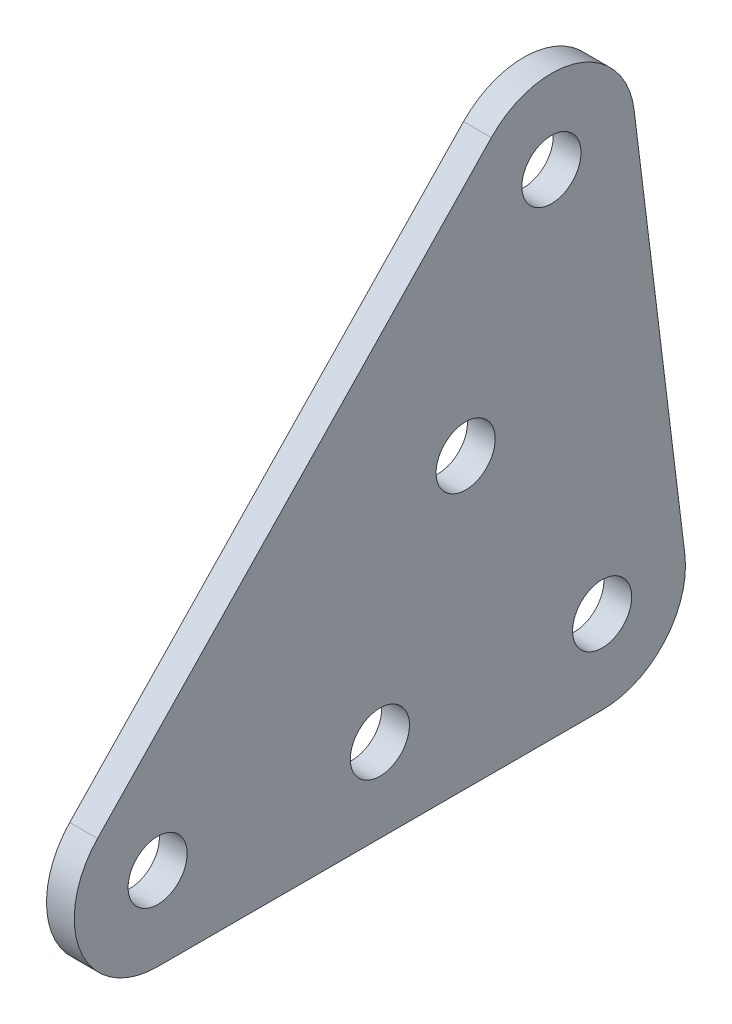
ISO-10303-21;
HEADER;
FILE_DESCRIPTION(('STEP AP214'),'2;1');
FILE_NAME('part.step','',(''),(''),'','','');
FILE_SCHEMA(('AUTOMOTIVE_DESIGN { 1 0 10303 214 1 1 1 1 }'));
ENDSEC;
DATA;
#1=APPLICATION_CONTEXT('core data for automotive mechanical design processes');
#2=APPLICATION_PROTOCOL_DEFINITION('international standard','automotive_design',2000,#1);
#3=PRODUCT_CONTEXT('',#1,'mechanical');
#4=PRODUCT('Part','Part','',(#3));
#5=PRODUCT_RELATED_PRODUCT_CATEGORY('part','',(#4));
#6=PRODUCT_DEFINITION_FORMATION('','',#4);
#7=PRODUCT_DEFINITION_CONTEXT('part definition',#1,'design');
#8=PRODUCT_DEFINITION('design','',#6,#7);
#9=PRODUCT_DEFINITION_SHAPE('','',#8);
#10=(LENGTH_UNIT() NAMED_UNIT(*) SI_UNIT(.MILLI.,.METRE.));
#11=(NAMED_UNIT(*) PLANE_ANGLE_UNIT() SI_UNIT($,.RADIAN.));
#12=(NAMED_UNIT(*) SI_UNIT($,.STERADIAN.) SOLID_ANGLE_UNIT());
#13=UNCERTAINTY_MEASURE_WITH_UNIT(LENGTH_MEASURE(1.E-05),#10,'distance_accuracy_value','');
#14=(GEOMETRIC_REPRESENTATION_CONTEXT(3) GLOBAL_UNCERTAINTY_ASSIGNED_CONTEXT((#13)) GLOBAL_UNIT_ASSIGNED_CONTEXT((#10,
#11,#12)) REPRESENTATION_CONTEXT('',''));
#15=CARTESIAN_POINT('',(0.,0.,0.));
#16=DIRECTION('',(0.,0.,1.));
#17=DIRECTION('',(1.,0.,0.));
#18=AXIS2_PLACEMENT_3D('',#15,#16,#17);
#19=CARTESIAN_POINT('',(92.8688124839999,191.769110544833,1165.24440739777));
#20=DIRECTION('',(1.,0.,0.));
#21=DIRECTION('',(0.,0.,-1.));
#22=AXIS2_PLACEMENT_3D('',#19,#20,#21);
#23=CYLINDRICAL_SURFACE('',#22,9.52500000000004);
#24=CARTESIAN_POINT('',(96.0438124839999,191.769110544833,1165.24440739777));
#25=DIRECTION('',(1.,0.,0.));
#26=DIRECTION('',(0.,0.,-1.));
#27=AXIS2_PLACEMENT_3D('',#24,#25,#26);
#28=CIRCLE('',#27,9.52500000000004);
#29=CARTESIAN_POINT('',(96.0438124839999,192.938018720197,1155.7914037123));
#30=VERTEX_POINT('',#29);
#31=CARTESIAN_POINT('',(96.0438124839999,198.36662242873,1172.11452107527));
#32=VERTEX_POINT('',#31);
#33=EDGE_CURVE('E124',#30,#32,#28,.T.);
#34=ORIENTED_EDGE('',*,*,#33,.F.);
#35=DIRECTION('',(1.,0.,0.));
#36=VECTOR('',#35,1.);
#37=CARTESIAN_POINT('',(92.8688124839999,192.938018720197,1155.7914037123));
#38=LINE('',#37,#36);
#39=CARTESIAN_POINT('',(92.8688124839999,192.938018720197,1155.7914037123));
#40=VERTEX_POINT('',#39);
#41=EDGE_CURVE('E11',#40,#30,#38,.T.);
#42=ORIENTED_EDGE('',*,*,#41,.F.);
#43=CARTESIAN_POINT('',(92.8688124839999,191.769110544833,1165.24440739777));
#44=DIRECTION('',(1.,0.,0.));
#45=DIRECTION('',(0.,0.,-1.));
#46=AXIS2_PLACEMENT_3D('',#43,#44,#45);
#47=CIRCLE('',#46,9.52500000000004);
#48=CARTESIAN_POINT('',(92.8688124839999,198.36662242873,1172.11452107527));
#49=VERTEX_POINT('',#48);
#50=EDGE_CURVE('E139',#40,#49,#47,.T.);
#51=ORIENTED_EDGE('',*,*,#50,.T.);
#52=DIRECTION('',(1.,0.,0.));
#53=VECTOR('',#52,1.);
#54=CARTESIAN_POINT('',(92.8688124839999,198.36662242873,1172.11452107527));
#55=LINE('',#54,#53);
#56=EDGE_CURVE('E42',#49,#32,#55,.T.);
#57=ORIENTED_EDGE('',*,*,#56,.T.);
#58=EDGE_LOOP('',(#34,#42,#51,#57));
#59=FACE_BOUND('',#58,.T.);
#60=ADVANCED_FACE('F39',(#59),#23,.T.);
#61=CARTESIAN_POINT('',(92.8688124839999,192.938018720197,1155.7914037123));
#62=DIRECTION('',(0.,0.122720018410974,-0.992441331808188));
#63=DIRECTION('',(0.,0.992441331808188,0.122720018410974));
#64=AXIS2_PLACEMENT_3D('',#61,#62,#63);
#65=PLANE('',#64);
#66=DIRECTION('',(0.,0.992441331808188,0.122720018410974));
#67=VECTOR('',#66,1.);
#68=CARTESIAN_POINT('',(96.0438124839999,192.938018720197,1155.7914037123));
#69=LINE('',#68,#67);
#70=CARTESIAN_POINT('',(96.0438124839999,146.073482729365,1149.99638436426));
#71=VERTEX_POINT('',#70);
#72=EDGE_CURVE('E137',#71,#30,#69,.T.);
#73=ORIENTED_EDGE('',*,*,#72,.F.);
#74=DIRECTION('',(1.,0.,0.));
#75=VECTOR('',#74,1.);
#76=CARTESIAN_POINT('',(92.8688124839999,146.073482729365,1149.99638436426));
#77=LINE('',#76,#75);
#78=CARTESIAN_POINT('',(92.8688124839999,146.073482729365,1149.99638436426));
#79=VERTEX_POINT('',#78);
#80=EDGE_CURVE('E48',#79,#71,#77,.T.);
#81=ORIENTED_EDGE('',*,*,#80,.F.);
#82=DIRECTION('',(0.,0.992441331808188,0.122720018410974));
#83=VECTOR('',#82,1.);
#84=CARTESIAN_POINT('',(92.8688124839999,192.938018720197,1155.7914037123));
#85=LINE('',#84,#83);
#86=EDGE_CURVE('E114',#79,#40,#85,.T.);
#87=ORIENTED_EDGE('',*,*,#86,.T.);
#88=ORIENTED_EDGE('',*,*,#41,.T.);
#89=EDGE_LOOP('',(#73,#81,#87,#88));
#90=FACE_BOUND('',#89,.T.);
#91=ADVANCED_FACE('F147',(#90),#65,.T.);
#92=CARTESIAN_POINT('',(92.8688124839999,144.904574554,1159.44938804973));
#93=DIRECTION('',(1.,0.,0.));
#94=DIRECTION('',(0.,0.,-1.));
#95=AXIS2_PLACEMENT_3D('',#92,#93,#94);
#96=CYLINDRICAL_SURFACE('',#95,9.52499999999999);
#97=CARTESIAN_POINT('',(96.0438124839999,144.904574554,1159.44938804973));
#98=DIRECTION('',(1.,0.,0.));
#99=DIRECTION('',(0.,0.,-1.));
#100=AXIS2_PLACEMENT_3D('',#97,#98,#99);
#101=CIRCLE('',#100,9.52499999999999);
#102=CARTESIAN_POINT('',(96.0438124839999,135.379574554,1159.44938804973));
#103=VERTEX_POINT('',#102);
#104=EDGE_CURVE('E101',#103,#71,#101,.T.);
#105=ORIENTED_EDGE('',*,*,#104,.F.);
#106=DIRECTION('',(1.,0.,0.));
#107=VECTOR('',#106,1.);
#108=CARTESIAN_POINT('',(92.8688124839999,135.379574554,1159.44938804973));
#109=LINE('',#108,#107);
#110=CARTESIAN_POINT('',(92.8688124839999,135.379574554,1159.44938804973));
#111=VERTEX_POINT('',#110);
#112=EDGE_CURVE('E96',#111,#103,#109,.T.);
#113=ORIENTED_EDGE('',*,*,#112,.F.);
#114=CARTESIAN_POINT('',(92.8688124839999,144.904574554,1159.44938804973));
#115=DIRECTION('',(1.,0.,0.));
#116=DIRECTION('',(0.,0.,-1.));
#117=AXIS2_PLACEMENT_3D('',#114,#115,#116);
#118=CIRCLE('',#117,9.52499999999999);
#119=EDGE_CURVE('E99',#111,#79,#118,.T.);
#120=ORIENTED_EDGE('',*,*,#119,.T.);
#121=ORIENTED_EDGE('',*,*,#80,.T.);
#122=EDGE_LOOP('',(#105,#113,#120,#121));
#123=FACE_BOUND('',#122,.T.);
#124=ADVANCED_FACE('F98',(#123),#96,.T.);
#125=CARTESIAN_POINT('',(92.8688124839999,135.379574554,1210.24938804973));
#126=DIRECTION('',(0.,-1.,0.));
#127=DIRECTION('',(0.,0.,-1.));
#128=AXIS2_PLACEMENT_3D('',#125,#126,#127);
#129=PLANE('',#128);
#130=DIRECTION('',(0.,0.,-1.));
#131=VECTOR('',#130,1.);
#132=CARTESIAN_POINT('',(96.0438124839999,135.379574554,1210.24938804973));
#133=LINE('',#132,#131);
#134=CARTESIAN_POINT('',(96.0438124839999,135.379574554,1210.24938804973));
#135=VERTEX_POINT('',#134);
#136=EDGE_CURVE('E134',#135,#103,#133,.T.);
#137=ORIENTED_EDGE('',*,*,#136,.F.);
#138=DIRECTION('',(1.,0.,0.));
#139=VECTOR('',#138,1.);
#140=CARTESIAN_POINT('',(92.8688124839999,135.379574554,1210.24938804973));
#141=LINE('',#140,#139);
#142=CARTESIAN_POINT('',(92.8688124839999,135.379574554,1210.24938804973));
#143=VERTEX_POINT('',#142);
#144=EDGE_CURVE('E106',#143,#135,#141,.T.);
#145=ORIENTED_EDGE('',*,*,#144,.F.);
#146=DIRECTION('',(0.,0.,-1.));
#147=VECTOR('',#146,1.);
#148=CARTESIAN_POINT('',(92.8688124839999,135.379574554,1210.24938804973));
#149=LINE('',#148,#147);
#150=EDGE_CURVE('E112',#143,#111,#149,.T.);
#151=ORIENTED_EDGE('',*,*,#150,.T.);
#152=ORIENTED_EDGE('',*,*,#112,.T.);
#153=EDGE_LOOP('',(#137,#145,#151,#152));
#154=FACE_BOUND('',#153,.T.);
#155=ADVANCED_FACE('F116',(#154),#129,.T.);
#156=CARTESIAN_POINT('',(92.8688124839999,144.904574554,1210.24938804973));
#157=DIRECTION('',(1.,0.,0.));
#158=DIRECTION('',(0.,0.,-1.));
#159=AXIS2_PLACEMENT_3D('',#156,#157,#158);
#160=CYLINDRICAL_SURFACE('',#159,9.52500000000005);
#161=CARTESIAN_POINT('',(96.0438124839999,144.904574554,1210.24938804973));
#162=DIRECTION('',(1.,0.,0.));
#163=DIRECTION('',(0.,0.,-1.));
#164=AXIS2_PLACEMENT_3D('',#161,#162,#163);
#165=CIRCLE('',#164,9.52500000000005);
#166=CARTESIAN_POINT('',(96.0438124839999,151.502086437898,1217.11950172724));
#167=VERTEX_POINT('',#166);
#168=EDGE_CURVE('E131',#167,#135,#165,.T.);
#169=ORIENTED_EDGE('',*,*,#168,.F.);
#170=DIRECTION('',(1.,0.,0.));
#171=VECTOR('',#170,1.);
#172=CARTESIAN_POINT('',(92.8688124839999,151.502086437898,1217.11950172724));
#173=LINE('',#172,#171);
#174=CARTESIAN_POINT('',(92.8688124839999,151.502086437898,1217.11950172724));
#175=VERTEX_POINT('',#174);
#176=EDGE_CURVE('E142',#175,#167,#173,.T.);
#177=ORIENTED_EDGE('',*,*,#176,.F.);
#178=CARTESIAN_POINT('',(92.8688124839999,144.904574554,1210.24938804973));
#179=DIRECTION('',(1.,0.,0.));
#180=DIRECTION('',(0.,0.,-1.));
#181=AXIS2_PLACEMENT_3D('',#178,#179,#180);
#182=CIRCLE('',#181,9.52500000000005);
#183=EDGE_CURVE('E117',#175,#143,#182,.T.);
#184=ORIENTED_EDGE('',*,*,#183,.T.);
#185=ORIENTED_EDGE('',*,*,#144,.T.);
#186=EDGE_LOOP('',(#169,#177,#184,#185));
#187=FACE_BOUND('',#186,.T.);
#188=ADVANCED_FACE('F160',(#187),#160,.T.);
#189=CARTESIAN_POINT('',(92.8688124839999,198.36662242873,1172.11452107527));
#190=DIRECTION('',(0.,0.692652166288489,0.721271777165766));
#191=DIRECTION('',(0.,-0.721271777165766,0.692652166288489));
#192=AXIS2_PLACEMENT_3D('',#189,#190,#191);
#193=PLANE('',#192);
#194=DIRECTION('',(0.,-0.721271777165766,0.692652166288489));
#195=VECTOR('',#194,1.);
#196=CARTESIAN_POINT('',(96.0438124839999,198.36662242873,1172.11452107527));
#197=LINE('',#196,#195);
#198=EDGE_CURVE('E127',#32,#167,#197,.T.);
#199=ORIENTED_EDGE('',*,*,#198,.F.);
#200=ORIENTED_EDGE('',*,*,#56,.F.);
#201=DIRECTION('',(0.,-0.721271777165766,0.692652166288489));
#202=VECTOR('',#201,1.);
#203=CARTESIAN_POINT('',(92.8688124839999,198.36662242873,1172.11452107527));
#204=LINE('',#203,#202);
#205=EDGE_CURVE('E119',#49,#175,#204,.T.);
#206=ORIENTED_EDGE('',*,*,#205,.T.);
#207=ORIENTED_EDGE('',*,*,#176,.T.);
#208=EDGE_LOOP('',(#199,#200,#206,#207));
#209=FACE_BOUND('',#208,.T.);
#210=ADVANCED_FACE('F144',(#209),#193,.T.);
#211=CARTESIAN_POINT('',(92.8688124839999,191.769110544833,1165.24440739777));
#212=DIRECTION('',(1.,0.,0.));
#213=DIRECTION('',(0.,0.,-1.));
#214=AXIS2_PLACEMENT_3D('',#211,#212,#213);
#215=PLANE('',#214);
#216=CARTESIAN_POINT('',(92.8688124839999,168.336842549416,1175.04689772375));
#217=DIRECTION('',(1.,0.,0.));
#218=DIRECTION('',(0.,0.,-1.));
#219=AXIS2_PLACEMENT_3D('',#216,#217,#218);
#220=CIRCLE('',#219,3.3782);
#221=CARTESIAN_POINT('',(92.8688124839999,168.336842549416,1171.66869772375));
#222=VERTEX_POINT('',#221);
#223=EDGE_CURVE('E198',#222,#222,#220,.T.);
#224=ORIENTED_EDGE('',*,*,#223,.T.);
#225=EDGE_LOOP('',(#224));
#226=FACE_BOUND('',#225,.T.);
#227=CARTESIAN_POINT('',(92.8688124839999,191.769110544833,1165.24440739777));
#228=DIRECTION('',(1.,0.,0.));
#229=DIRECTION('',(0.,0.,-1.));
#230=AXIS2_PLACEMENT_3D('',#227,#228,#229);
#231=CIRCLE('',#230,3.3782);
#232=CARTESIAN_POINT('',(92.8688124839999,191.769110544833,1161.86620739777));
#233=VERTEX_POINT('',#232);
#234=EDGE_CURVE('E208',#233,#233,#231,.T.);
#235=ORIENTED_EDGE('',*,*,#234,.T.);
#236=EDGE_LOOP('',(#235));
#237=FACE_BOUND('',#236,.T.);
#238=CARTESIAN_POINT('',(92.8688124839999,144.904574554,1210.24938804973));
#239=DIRECTION('',(1.,0.,0.));
#240=DIRECTION('',(0.,0.,-1.));
#241=AXIS2_PLACEMENT_3D('',#238,#239,#240);
#242=CIRCLE('',#241,3.3782);
#243=CARTESIAN_POINT('',(92.8688124839999,144.904574554,1206.87118804973));
#244=VERTEX_POINT('',#243);
#245=EDGE_CURVE('E214',#244,#244,#242,.T.);
#246=ORIENTED_EDGE('',*,*,#245,.T.);
#247=EDGE_LOOP('',(#246));
#248=FACE_BOUND('',#247,.T.);
#249=CARTESIAN_POINT('',(92.8688124839999,144.904574554,1184.84938804973));
#250=DIRECTION('',(1.,0.,0.));
#251=DIRECTION('',(0.,0.,-1.));
#252=AXIS2_PLACEMENT_3D('',#249,#250,#251);
#253=CIRCLE('',#252,3.3782);
#254=CARTESIAN_POINT('',(92.8688124839999,144.904574554,1181.47118804973));
#255=VERTEX_POINT('',#254);
#256=EDGE_CURVE('E220',#255,#255,#253,.T.);
#257=ORIENTED_EDGE('',*,*,#256,.T.);
#258=EDGE_LOOP('',(#257));
#259=FACE_BOUND('',#258,.T.);
#260=CARTESIAN_POINT('',(92.8688124839999,144.904574554,1159.44938804973));
#261=DIRECTION('',(1.,0.,0.));
#262=DIRECTION('',(0.,0.,-1.));
#263=AXIS2_PLACEMENT_3D('',#260,#261,#262);
#264=CIRCLE('',#263,3.3782);
#265=CARTESIAN_POINT('',(92.8688124839999,144.904574554,1156.07118804973));
#266=VERTEX_POINT('',#265);
#267=EDGE_CURVE('E128',#266,#266,#264,.T.);
#268=ORIENTED_EDGE('',*,*,#267,.T.);
#269=EDGE_LOOP('',(#268));
#270=FACE_BOUND('',#269,.T.);
#271=ORIENTED_EDGE('',*,*,#50,.F.);
#272=ORIENTED_EDGE('',*,*,#86,.F.);
#273=ORIENTED_EDGE('',*,*,#119,.F.);
#274=ORIENTED_EDGE('',*,*,#150,.F.);
#275=ORIENTED_EDGE('',*,*,#183,.F.);
#276=ORIENTED_EDGE('',*,*,#205,.F.);
#277=EDGE_LOOP('',(#271,#272,#273,#274,#275,#276));
#278=FACE_BOUND('',#277,.T.);
#279=ADVANCED_FACE('F110',(#226,#237,#248,#259,#270,#278),#215,.F.);
#280=CARTESIAN_POINT('',(96.0438124839999,191.769110544833,1165.24440739777));
#281=DIRECTION('',(1.,0.,0.));
#282=DIRECTION('',(0.,0.,-1.));
#283=AXIS2_PLACEMENT_3D('',#280,#281,#282);
#284=PLANE('',#283);
#285=CARTESIAN_POINT('',(96.0438124839999,168.336842549416,1175.04689772375));
#286=DIRECTION('',(1.,0.,0.));
#287=DIRECTION('',(0.,0.,-1.));
#288=AXIS2_PLACEMENT_3D('',#285,#286,#287);
#289=CIRCLE('',#288,3.3782);
#290=CARTESIAN_POINT('',(96.0438124839999,168.336842549416,1171.66869772375));
#291=VERTEX_POINT('',#290);
#292=EDGE_CURVE('E201',#291,#291,#289,.T.);
#293=ORIENTED_EDGE('',*,*,#292,.F.);
#294=EDGE_LOOP('',(#293));
#295=FACE_BOUND('',#294,.T.);
#296=CARTESIAN_POINT('',(96.0438124839999,191.769110544833,1165.24440739777));
#297=DIRECTION('',(1.,0.,0.));
#298=DIRECTION('',(0.,0.,-1.));
#299=AXIS2_PLACEMENT_3D('',#296,#297,#298);
#300=CIRCLE('',#299,3.3782);
#301=CARTESIAN_POINT('',(96.0438124839999,191.769110544833,1161.86620739777));
#302=VERTEX_POINT('',#301);
#303=EDGE_CURVE('E203',#302,#302,#300,.T.);
#304=ORIENTED_EDGE('',*,*,#303,.F.);
#305=EDGE_LOOP('',(#304));
#306=FACE_BOUND('',#305,.T.);
#307=CARTESIAN_POINT('',(96.0438124839999,144.904574554,1210.24938804973));
#308=DIRECTION('',(1.,0.,0.));
#309=DIRECTION('',(0.,0.,-1.));
#310=AXIS2_PLACEMENT_3D('',#307,#308,#309);
#311=CIRCLE('',#310,3.3782);
#312=CARTESIAN_POINT('',(96.0438124839999,144.904574554,1206.87118804973));
#313=VERTEX_POINT('',#312);
#314=EDGE_CURVE('E211',#313,#313,#311,.T.);
#315=ORIENTED_EDGE('',*,*,#314,.F.);
#316=EDGE_LOOP('',(#315));
#317=FACE_BOUND('',#316,.T.);
#318=CARTESIAN_POINT('',(96.0438124839999,144.904574554,1184.84938804973));
#319=DIRECTION('',(1.,0.,0.));
#320=DIRECTION('',(0.,0.,-1.));
#321=AXIS2_PLACEMENT_3D('',#318,#319,#320);
#322=CIRCLE('',#321,3.3782);
#323=CARTESIAN_POINT('',(96.0438124839999,144.904574554,1181.47118804973));
#324=VERTEX_POINT('',#323);
#325=EDGE_CURVE('E217',#324,#324,#322,.T.);
#326=ORIENTED_EDGE('',*,*,#325,.F.);
#327=EDGE_LOOP('',(#326));
#328=FACE_BOUND('',#327,.T.);
#329=CARTESIAN_POINT('',(96.0438124839999,144.904574554,1159.44938804973));
#330=DIRECTION('',(1.,0.,0.));
#331=DIRECTION('',(0.,0.,-1.));
#332=AXIS2_PLACEMENT_3D('',#329,#330,#331);
#333=CIRCLE('',#332,3.3782);
#334=CARTESIAN_POINT('',(96.0438124839999,144.904574554,1156.07118804973));
#335=VERTEX_POINT('',#334);
#336=EDGE_CURVE('E223',#335,#335,#333,.T.);
#337=ORIENTED_EDGE('',*,*,#336,.F.);
#338=EDGE_LOOP('',(#337));
#339=FACE_BOUND('',#338,.T.);
#340=ORIENTED_EDGE('',*,*,#33,.T.);
#341=ORIENTED_EDGE('',*,*,#198,.T.);
#342=ORIENTED_EDGE('',*,*,#168,.T.);
#343=ORIENTED_EDGE('',*,*,#136,.T.);
#344=ORIENTED_EDGE('',*,*,#104,.T.);
#345=ORIENTED_EDGE('',*,*,#72,.T.);
#346=EDGE_LOOP('',(#340,#341,#342,#343,#344,#345));
#347=FACE_BOUND('',#346,.T.);
#348=ADVANCED_FACE('F146',(#295,#306,#317,#328,#339,#347),#284,.T.);
#349=CARTESIAN_POINT('',(96.0438124839999,144.904574554,1159.44938804973));
#350=DIRECTION('',(1.,0.,0.));
#351=DIRECTION('',(0.,0.,-1.));
#352=AXIS2_PLACEMENT_3D('',#349,#350,#351);
#353=CYLINDRICAL_SURFACE('',#352,3.3782);
#354=ORIENTED_EDGE('',*,*,#267,.F.);
#355=EDGE_LOOP('',(#354));
#356=FACE_BOUND('',#355,.T.);
#357=ORIENTED_EDGE('',*,*,#336,.T.);
#358=EDGE_LOOP('',(#357));
#359=FACE_BOUND('',#358,.T.);
#360=ADVANCED_FACE('F171',(#356,#359),#353,.F.);
#361=CARTESIAN_POINT('',(96.0438124839999,144.904574554,1184.84938804973));
#362=DIRECTION('',(1.,0.,0.));
#363=DIRECTION('',(0.,0.,-1.));
#364=AXIS2_PLACEMENT_3D('',#361,#362,#363);
#365=CYLINDRICAL_SURFACE('',#364,3.3782);
#366=ORIENTED_EDGE('',*,*,#256,.F.);
#367=EDGE_LOOP('',(#366));
#368=FACE_BOUND('',#367,.T.);
#369=ORIENTED_EDGE('',*,*,#325,.T.);
#370=EDGE_LOOP('',(#369));
#371=FACE_BOUND('',#370,.T.);
#372=ADVANCED_FACE('F178',(#368,#371),#365,.F.);
#373=CARTESIAN_POINT('',(96.0438124839999,144.904574554,1210.24938804973));
#374=DIRECTION('',(1.,0.,0.));
#375=DIRECTION('',(0.,0.,-1.));
#376=AXIS2_PLACEMENT_3D('',#373,#374,#375);
#377=CYLINDRICAL_SURFACE('',#376,3.3782);
#378=ORIENTED_EDGE('',*,*,#245,.F.);
#379=EDGE_LOOP('',(#378));
#380=FACE_BOUND('',#379,.T.);
#381=ORIENTED_EDGE('',*,*,#314,.T.);
#382=EDGE_LOOP('',(#381));
#383=FACE_BOUND('',#382,.T.);
#384=ADVANCED_FACE('F182',(#380,#383),#377,.F.);
#385=CARTESIAN_POINT('',(96.0438124839999,191.769110544833,1165.24440739777));
#386=DIRECTION('',(1.,0.,0.));
#387=DIRECTION('',(0.,0.,-1.));
#388=AXIS2_PLACEMENT_3D('',#385,#386,#387);
#389=CYLINDRICAL_SURFACE('',#388,3.3782);
#390=ORIENTED_EDGE('',*,*,#234,.F.);
#391=EDGE_LOOP('',(#390));
#392=FACE_BOUND('',#391,.T.);
#393=ORIENTED_EDGE('',*,*,#303,.T.);
#394=EDGE_LOOP('',(#393));
#395=FACE_BOUND('',#394,.T.);
#396=ADVANCED_FACE('F186',(#392,#395),#389,.F.);
#397=CARTESIAN_POINT('',(96.0438124839999,168.336842549416,1175.04689772375));
#398=DIRECTION('',(1.,0.,0.));
#399=DIRECTION('',(0.,0.,-1.));
#400=AXIS2_PLACEMENT_3D('',#397,#398,#399);
#401=CYLINDRICAL_SURFACE('',#400,3.3782);
#402=ORIENTED_EDGE('',*,*,#223,.F.);
#403=EDGE_LOOP('',(#402));
#404=FACE_BOUND('',#403,.T.);
#405=ORIENTED_EDGE('',*,*,#292,.T.);
#406=EDGE_LOOP('',(#405));
#407=FACE_BOUND('',#406,.T.);
#408=ADVANCED_FACE('F190',(#404,#407),#401,.F.);
#409=CLOSED_SHELL('',(#60,#91,#124,#155,#188,#210,#279,#348,#360,#372,#384,#396,#408));
#410=MANIFOLD_SOLID_BREP('B2',#409);
#411=ADVANCED_BREP_SHAPE_REPRESENTATION('',(#18,#410),#14);
#412=SHAPE_DEFINITION_REPRESENTATION(#9,#411);
ENDSEC;
END-ISO-10303-21;
